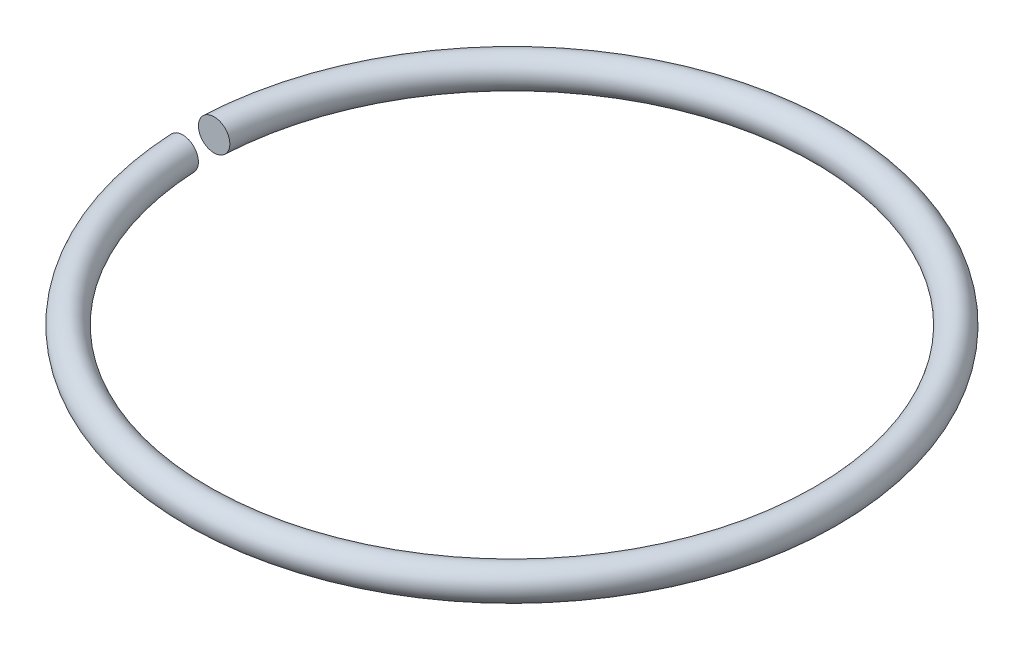
ISO-10303-21;
HEADER;
FILE_DESCRIPTION(('STEP AP214'),'2;1');
FILE_NAME('part.step','',(''),(''),'','','');
FILE_SCHEMA(('AUTOMOTIVE_DESIGN { 1 0 10303 214 1 1 1 1 }'));
ENDSEC;
DATA;
#1=APPLICATION_CONTEXT('core data for automotive mechanical design processes');
#2=APPLICATION_PROTOCOL_DEFINITION('international standard','automotive_design',2000,#1);
#3=PRODUCT_CONTEXT('',#1,'mechanical');
#4=PRODUCT('Part','Part','',(#3));
#5=PRODUCT_RELATED_PRODUCT_CATEGORY('part','',(#4));
#6=PRODUCT_DEFINITION_FORMATION('','',#4);
#7=PRODUCT_DEFINITION_CONTEXT('part definition',#1,'design');
#8=PRODUCT_DEFINITION('design','',#6,#7);
#9=PRODUCT_DEFINITION_SHAPE('','',#8);
#10=(LENGTH_UNIT() NAMED_UNIT(*) SI_UNIT(.MILLI.,.METRE.));
#11=(NAMED_UNIT(*) PLANE_ANGLE_UNIT() SI_UNIT($,.RADIAN.));
#12=(NAMED_UNIT(*) SI_UNIT($,.STERADIAN.) SOLID_ANGLE_UNIT());
#13=UNCERTAINTY_MEASURE_WITH_UNIT(LENGTH_MEASURE(1.E-05),#10,'distance_accuracy_value','');
#14=(GEOMETRIC_REPRESENTATION_CONTEXT(3) GLOBAL_UNCERTAINTY_ASSIGNED_CONTEXT((#13)) GLOBAL_UNIT_ASSIGNED_CONTEXT((#10,
#11,#12)) REPRESENTATION_CONTEXT('',''));
#15=CARTESIAN_POINT('',(0.,0.,0.));
#16=DIRECTION('',(0.,0.,1.));
#17=DIRECTION('',(1.,0.,0.));
#18=AXIS2_PLACEMENT_3D('',#15,#16,#17);
#19=CARTESIAN_POINT('',(0.,1.,0.));
#20=DIRECTION('',(0.,-1.,0.));
#21=DIRECTION('',(0.,0.,-1.));
#22=AXIS2_PLACEMENT_3D('',#19,#20,#21);
#23=TOROIDAL_SURFACE('',#22,20.,1.);
#24=CARTESIAN_POINT('',(-20.7397264348578,0.354571580153049,-0.999999999999999));
#25=CARTESIAN_POINT('',(-20.775985784985,0.397436107572821,-0.999999999999999));
#26=CARTESIAN_POINT('',(-20.8086541414015,0.443391497805317,-0.999999999999999));
#27=CARTESIAN_POINT('',(-20.8658394015595,0.540172500491813,-0.999999999999999));
#28=CARTESIAN_POINT('',(-20.8903465518958,0.591003847433223,-0.999999999999999));
#29=CARTESIAN_POINT('',(-20.930466229488,0.696043069640188,-0.999999999999999));
#30=CARTESIAN_POINT('',(-20.9460826791802,0.750249444168861,-0.999999999999999));
#31=CARTESIAN_POINT('',(-20.9679832298201,0.860500601046777,-0.999999999999999));
#32=CARTESIAN_POINT('',(-20.9742696378459,0.916544925413988,-0.999999999999999));
#33=CARTESIAN_POINT('',(-20.9773384251914,1.02887013053605,-0.999999999999999));
#34=CARTESIAN_POINT('',(-20.9741247478405,1.0851509034606,-0.999999999999999));
#35=CARTESIAN_POINT('',(-20.9582930886649,1.19637584096566,-0.999999999999999));
#36=CARTESIAN_POINT('',(-20.945674757173,1.25131995577046,-0.999999999999999));
#37=CARTESIAN_POINT('',(-20.9113957111979,1.35830466471239,-0.999999999999999));
#38=CARTESIAN_POINT('',(-20.8897359248209,1.41034555624424,-0.999999999999999));
#39=CARTESIAN_POINT('',(-20.8379919527733,1.51005522387422,-0.999999999999999));
#40=CARTESIAN_POINT('',(-20.8079077651246,1.55772399894574,-0.999999999999999));
#41=CARTESIAN_POINT('',(-20.7401511580338,1.64736828382949,-0.999999999999999));
#42=CARTESIAN_POINT('',(-20.702474180337,1.68934034822742,-0.999999999999999));
#43=CARTESIAN_POINT('',(-20.6206152421253,1.76637147375428,-0.999999999999999));
#44=CARTESIAN_POINT('',(-20.5764332589144,1.80143051076274,-0.999999999999999));
#45=CARTESIAN_POINT('',(-20.4827685979295,1.86368057507855,-0.999999999999999));
#46=CARTESIAN_POINT('',(-20.433280344474,1.8908632128544,-0.999999999999999));
#47=CARTESIAN_POINT('',(-20.3304463370768,1.93654492500475,-0.999999999999999));
#48=CARTESIAN_POINT('',(-20.2771005546263,1.95504393519574,-0.999999999999999));
#49=CARTESIAN_POINT('',(-20.1680024027765,1.98285376382727,-0.999999999999999));
#50=CARTESIAN_POINT('',(-20.1122474312558,1.99215437454837,-0.999999999999999));
#51=CARTESIAN_POINT('',(-19.9999673344306,2.00127025699164,-0.999999999999999));
#52=CARTESIAN_POINT('',(-19.9434422057169,2.00108548671129,-0.999999999999999));
#53=CARTESIAN_POINT('',(-19.8311850562664,1.99123290584426,-0.999999999999999));
#54=CARTESIAN_POINT('',(-19.7754536094331,1.98155855479694,-0.999999999999999));
#55=CARTESIAN_POINT('',(-19.6664059174646,1.95299017506983,-0.999999999999999));
#56=CARTESIAN_POINT('',(-19.6130896750881,1.93409613585901,-0.999999999999999));
#57=CARTESIAN_POINT('',(-19.5103911319148,1.88762322598109,-0.999999999999999));
#58=CARTESIAN_POINT('',(-19.4610085672352,1.860044938495,-0.999999999999999));
#59=CARTESIAN_POINT('',(-19.3675795290719,1.79698246329012,-0.999999999999999));
#60=CARTESIAN_POINT('',(-19.3235330358152,1.76149830486806,-0.999999999999999));
#61=CARTESIAN_POINT('',(-19.2420681692452,1.68366235459913,-0.999999999999999));
#62=CARTESIAN_POINT('',(-19.2046441635202,1.64131645794747,-0.999999999999999));
#63=CARTESIAN_POINT('',(-19.1374476505716,1.55093576999427,-0.999999999999999));
#64=CARTESIAN_POINT('',(-19.1076750903877,1.50290101807216,-0.999999999999999));
#65=CARTESIAN_POINT('',(-19.0566675693972,1.4025727404253,-0.999999999999999));
#66=CARTESIAN_POINT('',(-19.0354216060177,1.35028480845699,-0.999999999999999));
#67=CARTESIAN_POINT('',(-19.0020209226786,1.24288173820686,-0.999999999999999));
#68=CARTESIAN_POINT('',(-18.9898661378261,1.18776662010851,-0.999999999999999));
#69=CARTESIAN_POINT('',(-18.9750049211333,1.07634053589628,-0.999999999999999));
#70=CARTESIAN_POINT('',(-18.9722878265192,1.02003099169915,-0.999999999999999));
#71=CARTESIAN_POINT('',(-18.9763500247036,0.907755600627466,-0.999999999999999));
#72=CARTESIAN_POINT('',(-18.9831292877393,0.851789752676267,-0.999999999999999));
#73=CARTESIAN_POINT('',(-19.0059852586884,0.741813701907868,-0.999999999999999));
#74=CARTESIAN_POINT('',(-19.0220582189782,0.687802720126428,-0.999999999999999));
#75=CARTESIAN_POINT('',(-19.0630389949454,0.583243741129407,-0.999999999999999));
#76=CARTESIAN_POINT('',(-19.0879468161359,0.532695746074811,-0.999999999999999));
#77=CARTESIAN_POINT('',(-19.1459019034869,0.436467484380111,-0.999999999999999));
#78=CARTESIAN_POINT('',(-19.1789534628882,0.390789803544154,-0.999999999999999));
#79=CARTESIAN_POINT('',(-19.2522477193309,0.305623173909489,-0.999999999999999));
#80=CARTESIAN_POINT('',(-19.292490471941,0.26613427293794,-0.999999999999999));
#81=CARTESIAN_POINT('',(-19.3790753821808,0.194415617147947,-0.999999999999999));
#82=CARTESIAN_POINT('',(-19.4254247311792,0.162194544465014,-0.999999999999999));
#83=CARTESIAN_POINT('',(-19.5228696374458,0.10597947266564,-0.999999999999999));
#84=CARTESIAN_POINT('',(-19.5739652382999,0.0819855491106003,-0.999999999999999));
#85=CARTESIAN_POINT('',(-19.6795226865169,0.0428748038475855,-0.999999999999999));
#86=CARTESIAN_POINT('',(-19.7339887719687,0.0277694200830511,-0.999999999999999));
#87=CARTESIAN_POINT('',(-19.8446810533615,0.00690999031759179,-0.999999999999999));
#88=CARTESIAN_POINT('',(-19.90090718933,0.00115562604099272,-0.999999999999999));
#89=CARTESIAN_POINT('',(-20.0135648570868,-0.000841386651310134,-0.999999999999999));
#90=CARTESIAN_POINT('',(-20.0699964993226,0.00292220015851783,-0.999999999999999));
#91=CARTESIAN_POINT('',(-20.1814422691657,0.0198723686144294,-0.999999999999999));
#92=CARTESIAN_POINT('',(-20.2364560401173,0.0330612976279066,-0.999999999999999));
#93=CARTESIAN_POINT('',(-20.3435060801263,0.0684958749776883,-0.999999999999999));
#94=CARTESIAN_POINT('',(-20.395541050292,0.0907454403643689,-0.999999999999999));
#95=CARTESIAN_POINT('',(-20.4950851252592,0.143659794592275,-0.999999999999999));
#96=CARTESIAN_POINT('',(-20.5425996093736,0.174314408470719,-0.999999999999999));
#97=CARTESIAN_POINT('',(-20.6150812848411,0.230251575740945,-0.999999999999999));
#98=CARTESIAN_POINT('',(-20.6418367035296,0.253257700006494,-0.999999999999999));
#99=CARTESIAN_POINT('',(-20.6927754989422,0.301960199144801,-0.999999999999999));
#100=CARTESIAN_POINT('',(-20.7169588760885,0.327656573576094,-0.999999999999999));
#101=CARTESIAN_POINT('',(-20.7397264348578,0.354571580153049,-0.999999999999999));
#102=B_SPLINE_CURVE_WITH_KNOTS('',3,(#24,#25,#26,#27,#28,#29,#30,#31,#32,#33,#34,#35,#36,#37,
#38,#39,#40,#41,#42,#43,#44,#45,#46,#47,#48,#49,#50,#51,#52,#53,#54,#55,#56,#57,#58,#59,#60,#61,
#62,#63,#64,#65,#66,#67,#68,#69,#70,#71,#72,#73,#74,#75,#76,#77,#78,#79,#80,#81,#82,#83,#84,#85,
#86,#87,#88,#89,#90,#91,#92,#93,#94,#95,#96,#97,#98,#99,#100,#101),.UNSPECIFIED.,.T.,.F.,(4,2,2,
2,2,2,2,2,2,2,2,2,2,2,2,2,2,2,2,2,2,2,2,2,2,2,2,2,2,2,2,2,2,2,2,2,2,2,4),(0.,0.168302393450667,
0.336805208169993,0.505233624391996,0.67362038567847,0.841937262201897,1.01026039709668,
1.17856625785332,1.34687215812988,1.51527940177551,1.68368723300642,1.85227378961205,
2.02086159227576,2.189636272287,2.35841169965495,2.52730353313736,2.69619555953393,
2.86507624659254,3.0339563078415,3.20269203931158,3.37142660282683,3.5399427286529,
3.70845765159953,3.87678212307554,4.04510606700131,4.21336218266766,4.38161840332887,
4.54996351632377,4.71830993023283,4.88685639777663,5.05540441327658,5.22416884795341,
5.39292753836467,5.56179681150775,5.73070815595409,5.89969260098663,6.06847337363816,
6.17415191584213,6.27983044070445),.UNSPECIFIED.);
#103=CARTESIAN_POINT('',(-20.7397264348578,0.354571580153049,-0.999999999999999));
#104=VERTEX_POINT('',#103);
#105=EDGE_CURVE('E10',#104,#104,#102,.T.);
#106=ORIENTED_EDGE('',*,*,#105,.T.);
#107=EDGE_LOOP('',(#106));
#108=FACE_BOUND('',#107,.T.);
#109=CARTESIAN_POINT('',(-20.7397264348578,0.354571580153049,1.));
#110=CARTESIAN_POINT('',(-20.7034047940602,0.311641145469235,1.));
#111=CARTESIAN_POINT('',(-20.6634278024441,0.27174926949927,1.));
#112=CARTESIAN_POINT('',(-20.5773080112511,0.199213305164222,1.));
#113=CARTESIAN_POINT('',(-20.5311577605172,0.166578104401957,1.));
#114=CARTESIAN_POINT('',(-20.4340539064351,0.109532446690529,1.));
#115=CARTESIAN_POINT('',(-20.3831028381153,0.0851176798206022,1.));
#116=CARTESIAN_POINT('',(-20.2778412901556,0.0451883269571836,1.));
#117=CARTESIAN_POINT('',(-20.223531648473,0.0296715307841985,1.));
#118=CARTESIAN_POINT('',(-20.1130307772283,0.00795353910002325,1.));
#119=CARTESIAN_POINT('',(-20.0568379391804,0.00176052585158059,1.));
#120=CARTESIAN_POINT('',(-19.9442074865518,-0.00110984074930841,1.));
#121=CARTESIAN_POINT('',(-19.8877698613443,0.00221322322871637,1.));
#122=CARTESIAN_POINT('',(-19.7762206448347,0.0182862345459986,1.));
#123=CARTESIAN_POINT('',(-19.7211098182836,0.0310414902355954,1.));
#124=CARTESIAN_POINT('',(-19.6138124748127,0.0656250238229156,1.));
#125=CARTESIAN_POINT('',(-19.5616259528078,0.0874532859428962,1.));
#126=CARTESIAN_POINT('',(-19.4616713700178,0.139561156769367,1.));
#127=CARTESIAN_POINT('',(-19.4139024149254,0.169839049895362,1.));
#128=CARTESIAN_POINT('',(-19.3241321050359,0.237991970901085,1.));
#129=CARTESIAN_POINT('',(-19.2821307145017,0.275866951703998,1.));
#130=CARTESIAN_POINT('',(-19.2051321091724,0.358101200582438,1.));
#131=CARTESIAN_POINT('',(-19.170128208084,0.402454207895982,1.));
#132=CARTESIAN_POINT('',(-19.1080750438647,0.496413831015416,1.));
#133=CARTESIAN_POINT('',(-19.0810257317309,0.546020414454984,1.));
#134=CARTESIAN_POINT('',(-19.0356869450255,0.649009138084592,1.));
#135=CARTESIAN_POINT('',(-19.0173860189593,0.702386237039664,1.));
#136=CARTESIAN_POINT('',(-18.9900157428169,0.811456945960827,1.));
#137=CARTESIAN_POINT('',(-18.9809463275478,0.86715053956492,1.));
#138=CARTESIAN_POINT('',(-18.9723037117957,0.97921111701258,1.));
#139=CARTESIAN_POINT('',(-18.9727206202619,1.03557733822673,1.));
#140=CARTESIAN_POINT('',(-18.9830143062991,1.14743912878021,1.));
#141=CARTESIAN_POINT('',(-18.9928910592975,1.20293470038073,1.));
#142=CARTESIAN_POINT('',(-19.0218178825652,1.31146601084051,1.));
#143=CARTESIAN_POINT('',(-19.0408656481761,1.36450236402781,1.));
#144=CARTESIAN_POINT('',(-19.0875890910121,1.46662750005172,1.));
#145=CARTESIAN_POINT('',(-19.1152647895378,1.51571627314219,1.));
#146=CARTESIAN_POINT('',(-19.1784761366599,1.60858932227425,1.));
#147=CARTESIAN_POINT('',(-19.2140170234836,1.65237003291794,1.));
#148=CARTESIAN_POINT('',(-19.2919361632383,1.73335255756107,1.));
#149=CARTESIAN_POINT('',(-19.3343144600603,1.77055432932548,1.));
#150=CARTESIAN_POINT('',(-19.4247617449274,1.83737267867152,1.));
#151=CARTESIAN_POINT('',(-19.4728377638043,1.86697973906423,1.));
#152=CARTESIAN_POINT('',(-19.5732733838568,1.91771380840324,1.));
#153=CARTESIAN_POINT('',(-19.6256330147084,1.93884075859525,1.));
#154=CARTESIAN_POINT('',(-19.733218136996,1.97204036588693,1.));
#155=CARTESIAN_POINT('',(-19.7884470387187,1.98410197234295,1.));
#156=CARTESIAN_POINT('',(-19.9001457203183,1.9987884752676,1.));
#157=CARTESIAN_POINT('',(-19.9566155063093,2.00141332522953,1.));
#158=CARTESIAN_POINT('',(-20.0692311894231,1.99715038381831,1.));
#159=CARTESIAN_POINT('',(-20.1253768568289,1.99025652014536,1.));
#160=CARTESIAN_POINT('',(-20.235713523669,1.9671390024309,1.));
#161=CARTESIAN_POINT('',(-20.2899045247663,1.95091535632799,1.));
#162=CARTESIAN_POINT('',(-20.3947820748576,1.90959931405184,1.));
#163=CARTESIAN_POINT('',(-20.4454692507455,1.88450850930028,1.));
#164=CARTESIAN_POINT('',(-20.5419069525184,1.8261662981444,1.));
#165=CARTESIAN_POINT('',(-20.5876574885259,1.79291490847357,1.));
#166=CARTESIAN_POINT('',(-20.6728799884495,1.71922510647458,1.));
#167=CARTESIAN_POINT('',(-20.712357334282,1.67879291848648,1.));
#168=CARTESIAN_POINT('',(-20.7839543310763,1.59186800172918,1.));
#169=CARTESIAN_POINT('',(-20.8160740120422,1.54537529767553,1.));
#170=CARTESIAN_POINT('',(-20.8720054786543,1.44770543881132,1.));
#171=CARTESIAN_POINT('',(-20.8958265820224,1.39653361982322,1.));
#172=CARTESIAN_POINT('',(-20.9345292272749,1.29091643062336,1.));
#173=CARTESIAN_POINT('',(-20.9494111725162,1.23647120823762,1.));
#174=CARTESIAN_POINT('',(-20.9698005345742,1.12591319969718,1.));
#175=CARTESIAN_POINT('',(-20.9753179040413,1.06980224851311,1.));
#176=CARTESIAN_POINT('',(-20.9768503298216,0.957435494935053,1.));
#177=CARTESIAN_POINT('',(-20.9728630498039,0.901179660322667,1.));
#178=CARTESIAN_POINT('',(-20.9554988185881,0.790137671618542,1.));
#179=CARTESIAN_POINT('',(-20.9421211757822,0.735351626086534,1.));
#180=CARTESIAN_POINT('',(-20.9063640391434,0.628851094382731,1.));
#181=CARTESIAN_POINT('',(-20.8839954085583,0.577132987641342,1.));
#182=CARTESIAN_POINT('',(-20.8409441157667,0.496873746089144,1.));
#183=CARTESIAN_POINT('',(-20.8228013619059,0.466941668519371,1.));
#184=CARTESIAN_POINT('',(-20.7834857118463,0.409138594700949,1.));
#185=CARTESIAN_POINT('',(-20.7623128162708,0.381267598028344,1.));
#186=CARTESIAN_POINT('',(-20.7397264348578,0.354571580153049,1.));
#187=B_SPLINE_CURVE_WITH_KNOTS('',3,(#109,#110,#111,#112,#113,#114,#115,#116,#117,#118,#119,
#120,#121,#122,#123,#124,#125,#126,#127,#128,#129,#130,#131,#132,#133,#134,#135,#136,#137,#138,
#139,#140,#141,#142,#143,#144,#145,#146,#147,#148,#149,#150,#151,#152,#153,#154,#155,#156,#157,
#158,#159,#160,#161,#162,#163,#164,#165,#166,#167,#168,#169,#170,#171,#172,#173,#174,#175,#176,
#177,#178,#179,#180,#181,#182,#183,#184,#185,#186),.UNSPECIFIED.,.T.,.F.,(4,2,2,2,2,2,2,2,2,2,2,
2,2,2,2,2,2,2,2,2,2,2,2,2,2,2,2,2,2,2,2,2,2,2,2,2,2,2,4),(0.,0.168574739246387,
0.337354816685031,0.50604626551468,0.674695794667106,0.843493239322492,1.0122980867547,
1.18119800836752,1.35009763626862,1.51896299635898,1.68782731007497,1.85652948982574,
2.02523063029364,2.19371033489434,2.36218884968156,2.5304917059963,2.6987941251341,
2.86705427224686,3.035314834763,3.20368779813239,3.37206184237185,3.54064586226109,
3.70923105016162,3.87802141138415,4.0468126044468,4.21571152471405,4.38461030126745,
4.55347878031539,4.72234691309688,4.89106937853333,5.05979115592012,5.22832287564679,
5.39684699023511,5.56519188535576,5.73357816547605,5.90197684868257,6.07017267499182,
6.17499982643067,6.27982695630694),.UNSPECIFIED.);
#188=CARTESIAN_POINT('',(-20.7397264348578,0.354571580153049,1.));
#189=VERTEX_POINT('',#188);
#190=EDGE_CURVE('E48',#189,#189,#187,.T.);
#191=ORIENTED_EDGE('',*,*,#190,.T.);
#192=EDGE_LOOP('',(#191));
#193=FACE_BOUND('',#192,.T.);
#194=ADVANCED_FACE('F37',(#108,#193),#23,.T.);
#195=CARTESIAN_POINT('',(-23.1189285045633,-1.2E-05,1.));
#196=DIRECTION('',(0.,0.,1.));
#197=DIRECTION('',(1.,0.,0.));
#198=AXIS2_PLACEMENT_3D('',#195,#196,#197);
#199=PLANE('',#198);
#200=ORIENTED_EDGE('',*,*,#190,.F.);
#201=EDGE_LOOP('',(#200));
#202=FACE_BOUND('',#201,.T.);
#203=ADVANCED_FACE('F57',(#202),#199,.F.);
#204=CARTESIAN_POINT('',(-23.1189285045633,-1.2E-05,-0.999999999999999));
#205=DIRECTION('',(0.,0.,-1.));
#206=DIRECTION('',(-1.,0.,0.));
#207=AXIS2_PLACEMENT_3D('',#204,#205,#206);
#208=PLANE('',#207);
#209=ORIENTED_EDGE('',*,*,#105,.F.);
#210=EDGE_LOOP('',(#209));
#211=FACE_BOUND('',#210,.T.);
#212=ADVANCED_FACE('F60',(#211),#208,.F.);
#213=CLOSED_SHELL('',(#194,#203,#212));
#214=MANIFOLD_SOLID_BREP('B2',#213);
#215=ADVANCED_BREP_SHAPE_REPRESENTATION('',(#18,#214),#14);
#216=SHAPE_DEFINITION_REPRESENTATION(#9,#215);
ENDSEC;
END-ISO-10303-21;
